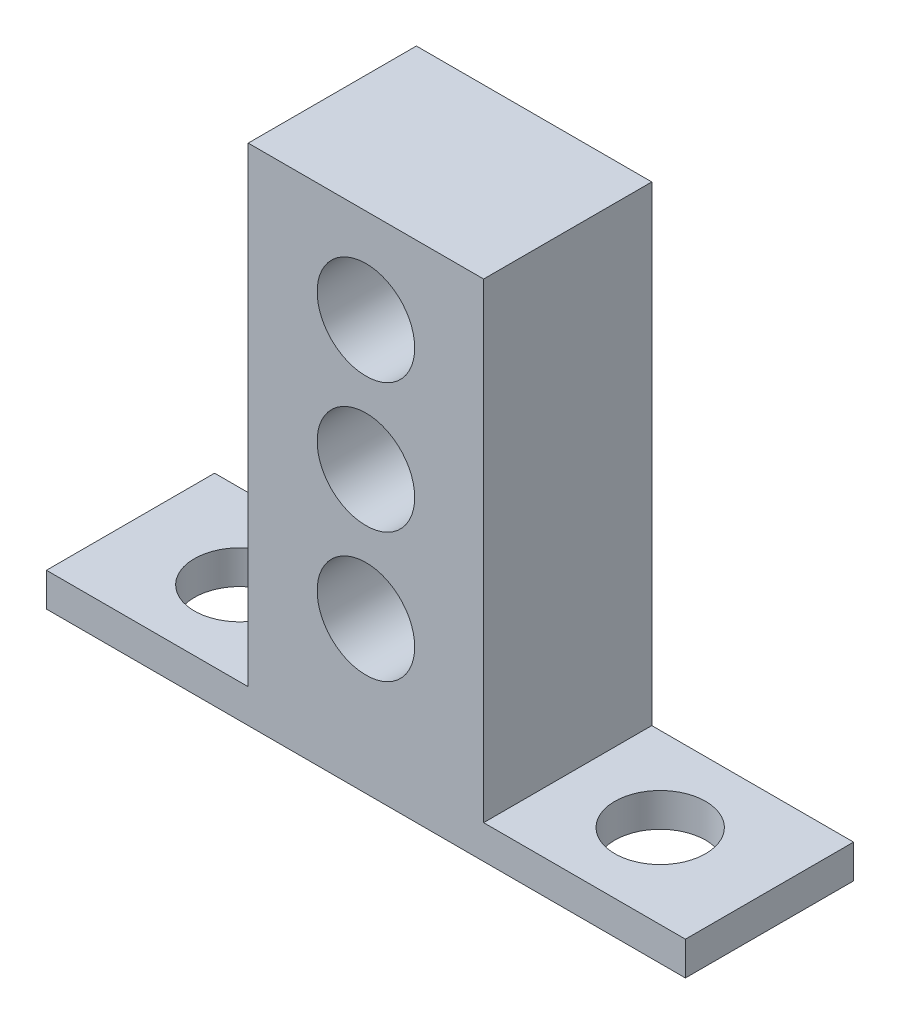
ISO-10303-21;
HEADER;
FILE_DESCRIPTION(('STEP AP214'),'2;1');
FILE_NAME('part.step','',(''),(''),'','','');
FILE_SCHEMA(('AUTOMOTIVE_DESIGN { 1 0 10303 214 1 1 1 1 }'));
ENDSEC;
DATA;
#1=APPLICATION_CONTEXT('core data for automotive mechanical design processes');
#2=APPLICATION_PROTOCOL_DEFINITION('international standard','automotive_design',2000,#1);
#3=PRODUCT_CONTEXT('',#1,'mechanical');
#4=PRODUCT('Part','Part','',(#3));
#5=PRODUCT_RELATED_PRODUCT_CATEGORY('part','',(#4));
#6=PRODUCT_DEFINITION_FORMATION('','',#4);
#7=PRODUCT_DEFINITION_CONTEXT('part definition',#1,'design');
#8=PRODUCT_DEFINITION('design','',#6,#7);
#9=PRODUCT_DEFINITION_SHAPE('','',#8);
#10=(LENGTH_UNIT() NAMED_UNIT(*) SI_UNIT(.MILLI.,.METRE.));
#11=(NAMED_UNIT(*) PLANE_ANGLE_UNIT() SI_UNIT($,.RADIAN.));
#12=(NAMED_UNIT(*) SI_UNIT($,.STERADIAN.) SOLID_ANGLE_UNIT());
#13=UNCERTAINTY_MEASURE_WITH_UNIT(LENGTH_MEASURE(1.E-05),#10,'distance_accuracy_value','');
#14=(GEOMETRIC_REPRESENTATION_CONTEXT(3) GLOBAL_UNCERTAINTY_ASSIGNED_CONTEXT((#13)) GLOBAL_UNIT_ASSIGNED_CONTEXT((#10,
#11,#12)) REPRESENTATION_CONTEXT('',''));
#15=CARTESIAN_POINT('',(0.,0.,0.));
#16=DIRECTION('',(0.,0.,1.));
#17=DIRECTION('',(1.,0.,0.));
#18=AXIS2_PLACEMENT_3D('',#15,#16,#17);
#19=CARTESIAN_POINT('',(0.,0.,12.7));
#20=DIRECTION('',(1.,0.,0.));
#21=DIRECTION('',(0.,0.,-1.));
#22=AXIS2_PLACEMENT_3D('',#19,#20,#21);
#23=PLANE('',#22);
#24=DIRECTION('',(0.,0.,-1.));
#25=VECTOR('',#24,1.);
#26=CARTESIAN_POINT('',(0.,2.54,12.7));
#27=LINE('',#26,#25);
#28=CARTESIAN_POINT('',(0.,2.54,12.7));
#29=VERTEX_POINT('',#28);
#30=CARTESIAN_POINT('',(0.,2.54,0.));
#31=VERTEX_POINT('',#30);
#32=EDGE_CURVE('E49',#29,#31,#27,.T.);
#33=ORIENTED_EDGE('',*,*,#32,.F.);
#34=DIRECTION('',(0.,-1.,0.));
#35=VECTOR('',#34,1.);
#36=CARTESIAN_POINT('',(0.,0.,12.7));
#37=LINE('',#36,#35);
#38=CARTESIAN_POINT('',(0.,38.1,12.7));
#39=VERTEX_POINT('',#38);
#40=EDGE_CURVE('E122',#39,#29,#37,.T.);
#41=ORIENTED_EDGE('',*,*,#40,.F.);
#42=DIRECTION('',(0.,0.,-1.));
#43=VECTOR('',#42,1.);
#44=CARTESIAN_POINT('',(0.,38.1,12.7));
#45=LINE('',#44,#43);
#46=CARTESIAN_POINT('',(0.,38.1,0.));
#47=VERTEX_POINT('',#46);
#48=EDGE_CURVE('E41',#39,#47,#45,.T.);
#49=ORIENTED_EDGE('',*,*,#48,.T.);
#50=DIRECTION('',(0.,-1.,0.));
#51=VECTOR('',#50,1.);
#52=CARTESIAN_POINT('',(0.,0.,0.));
#53=LINE('',#52,#51);
#54=EDGE_CURVE('E160',#47,#31,#53,.T.);
#55=ORIENTED_EDGE('',*,*,#54,.T.);
#56=EDGE_LOOP('',(#33,#41,#49,#55));
#57=FACE_BOUND('',#56,.T.);
#58=ADVANCED_FACE('F33',(#57),#23,.F.);
#59=CARTESIAN_POINT('',(17.78,0.,12.7));
#60=DIRECTION('',(-1.,0.,0.));
#61=DIRECTION('',(0.,0.,1.));
#62=AXIS2_PLACEMENT_3D('',#59,#60,#61);
#63=PLANE('',#62);
#64=DIRECTION('',(0.,0.,1.));
#65=VECTOR('',#64,1.);
#66=CARTESIAN_POINT('',(17.78,2.54,12.7));
#67=LINE('',#66,#65);
#68=CARTESIAN_POINT('',(17.78,2.54,0.));
#69=VERTEX_POINT('',#68);
#70=CARTESIAN_POINT('',(17.78,2.54,12.7));
#71=VERTEX_POINT('',#70);
#72=EDGE_CURVE('E57',#69,#71,#67,.T.);
#73=ORIENTED_EDGE('',*,*,#72,.F.);
#74=DIRECTION('',(0.,1.,0.));
#75=VECTOR('',#74,1.);
#76=CARTESIAN_POINT('',(17.78,0.,0.));
#77=LINE('',#76,#75);
#78=CARTESIAN_POINT('',(17.78,38.1,0.));
#79=VERTEX_POINT('',#78);
#80=EDGE_CURVE('E174',#69,#79,#77,.T.);
#81=ORIENTED_EDGE('',*,*,#80,.T.);
#82=DIRECTION('',(0.,0.,-1.));
#83=VECTOR('',#82,1.);
#84=CARTESIAN_POINT('',(17.78,38.1,12.7));
#85=LINE('',#84,#83);
#86=CARTESIAN_POINT('',(17.78,38.1,12.7));
#87=VERTEX_POINT('',#86);
#88=EDGE_CURVE('E11',#87,#79,#85,.T.);
#89=ORIENTED_EDGE('',*,*,#88,.F.);
#90=DIRECTION('',(0.,1.,0.));
#91=VECTOR('',#90,1.);
#92=CARTESIAN_POINT('',(17.78,0.,12.7));
#93=LINE('',#92,#91);
#94=EDGE_CURVE('E167',#71,#87,#93,.T.);
#95=ORIENTED_EDGE('',*,*,#94,.F.);
#96=EDGE_LOOP('',(#73,#81,#89,#95));
#97=FACE_BOUND('',#96,.T.);
#98=ADVANCED_FACE('F211',(#97),#63,.F.);
#99=CARTESIAN_POINT('',(0.,0.,12.7));
#100=DIRECTION('',(0.,0.,-1.));
#101=DIRECTION('',(-1.,0.,0.));
#102=AXIS2_PLACEMENT_3D('',#99,#100,#101);
#103=PLANE('',#102);
#104=ORIENTED_EDGE('',*,*,#40,.T.);
#105=DIRECTION('',(1.,0.,0.));
#106=VECTOR('',#105,1.);
#107=CARTESIAN_POINT('',(-15.24,2.54,12.7));
#108=LINE('',#107,#106);
#109=CARTESIAN_POINT('',(-15.24,2.54,12.7));
#110=VERTEX_POINT('',#109);
#111=EDGE_CURVE('E104',#110,#29,#108,.T.);
#112=ORIENTED_EDGE('',*,*,#111,.F.);
#113=DIRECTION('',(0.,1.,0.));
#114=VECTOR('',#113,1.);
#115=CARTESIAN_POINT('',(-15.24,0.,12.7));
#116=LINE('',#115,#114);
#117=CARTESIAN_POINT('',(-15.24,0.,12.7));
#118=VERTEX_POINT('',#117);
#119=EDGE_CURVE('E111',#118,#110,#116,.T.);
#120=ORIENTED_EDGE('',*,*,#119,.F.);
#121=DIRECTION('',(1.,0.,0.));
#122=VECTOR('',#121,1.);
#123=CARTESIAN_POINT('',(0.,0.,12.7));
#124=LINE('',#123,#122);
#125=CARTESIAN_POINT('',(33.02,0.,12.7));
#126=VERTEX_POINT('',#125);
#127=EDGE_CURVE('E164',#118,#126,#124,.T.);
#128=ORIENTED_EDGE('',*,*,#127,.T.);
#129=DIRECTION('',(0.,-1.,0.));
#130=VECTOR('',#129,1.);
#131=CARTESIAN_POINT('',(33.02,0.,12.7));
#132=LINE('',#131,#130);
#133=CARTESIAN_POINT('',(33.02,2.54,12.7));
#134=VERTEX_POINT('',#133);
#135=EDGE_CURVE('E124',#134,#126,#132,.T.);
#136=ORIENTED_EDGE('',*,*,#135,.F.);
#137=DIRECTION('',(-1.,0.,0.));
#138=VECTOR('',#137,1.);
#139=CARTESIAN_POINT('',(33.02,2.54,12.7));
#140=LINE('',#139,#138);
#141=EDGE_CURVE('E137',#134,#71,#140,.T.);
#142=ORIENTED_EDGE('',*,*,#141,.T.);
#143=ORIENTED_EDGE('',*,*,#94,.T.);
#144=DIRECTION('',(-1.,0.,0.));
#145=VECTOR('',#144,1.);
#146=CARTESIAN_POINT('',(0.,38.1,12.7));
#147=LINE('',#146,#145);
#148=EDGE_CURVE('E169',#87,#39,#147,.T.);
#149=ORIENTED_EDGE('',*,*,#148,.T.);
#150=EDGE_LOOP('',(#104,#112,#120,#128,#136,#142,#143,#149));
#151=FACE_BOUND('',#150,.T.);
#152=CARTESIAN_POINT('',(8.89,30.988,12.7));
#153=DIRECTION('',(0.,0.,1.));
#154=DIRECTION('',(1.,0.,0.));
#155=AXIS2_PLACEMENT_3D('',#152,#153,#154);
#156=CIRCLE('',#155,3.683);
#157=CARTESIAN_POINT('',(12.573,30.988,12.7));
#158=VERTEX_POINT('',#157);
#159=EDGE_CURVE('E157',#158,#158,#156,.T.);
#160=ORIENTED_EDGE('',*,*,#159,.F.);
#161=EDGE_LOOP('',(#160));
#162=FACE_BOUND('',#161,.T.);
#163=CARTESIAN_POINT('',(8.89,21.209,12.7));
#164=DIRECTION('',(0.,0.,1.));
#165=DIRECTION('',(1.,0.,0.));
#166=AXIS2_PLACEMENT_3D('',#163,#164,#165);
#167=CIRCLE('',#166,3.683);
#168=CARTESIAN_POINT('',(12.573,21.209,12.7));
#169=VERTEX_POINT('',#168);
#170=EDGE_CURVE('E151',#169,#169,#167,.T.);
#171=ORIENTED_EDGE('',*,*,#170,.F.);
#172=EDGE_LOOP('',(#171));
#173=FACE_BOUND('',#172,.T.);
#174=CARTESIAN_POINT('',(8.89,11.43,12.7));
#175=DIRECTION('',(0.,0.,1.));
#176=DIRECTION('',(1.,0.,0.));
#177=AXIS2_PLACEMENT_3D('',#174,#175,#176);
#178=CIRCLE('',#177,3.683);
#179=CARTESIAN_POINT('',(12.573,11.43,12.7));
#180=VERTEX_POINT('',#179);
#181=EDGE_CURVE('E145',#180,#180,#178,.T.);
#182=ORIENTED_EDGE('',*,*,#181,.F.);
#183=EDGE_LOOP('',(#182));
#184=FACE_BOUND('',#183,.T.);
#185=ADVANCED_FACE('F120',(#151,#162,#173,#184),#103,.F.);
#186=CARTESIAN_POINT('',(0.,0.,0.));
#187=DIRECTION('',(0.,0.,-1.));
#188=DIRECTION('',(-1.,0.,0.));
#189=AXIS2_PLACEMENT_3D('',#186,#187,#188);
#190=PLANE('',#189);
#191=CARTESIAN_POINT('',(8.89,21.209,0.));
#192=DIRECTION('',(0.,0.,1.));
#193=DIRECTION('',(1.,0.,0.));
#194=AXIS2_PLACEMENT_3D('',#191,#192,#193);
#195=CIRCLE('',#194,3.683);
#196=CARTESIAN_POINT('',(12.573,21.209,0.));
#197=VERTEX_POINT('',#196);
#198=EDGE_CURVE('E148',#197,#197,#195,.T.);
#199=ORIENTED_EDGE('',*,*,#198,.T.);
#200=EDGE_LOOP('',(#199));
#201=FACE_BOUND('',#200,.T.);
#202=ORIENTED_EDGE('',*,*,#54,.F.);
#203=DIRECTION('',(-1.,0.,0.));
#204=VECTOR('',#203,1.);
#205=CARTESIAN_POINT('',(0.,38.1,0.));
#206=LINE('',#205,#204);
#207=EDGE_CURVE('E165',#79,#47,#206,.T.);
#208=ORIENTED_EDGE('',*,*,#207,.F.);
#209=ORIENTED_EDGE('',*,*,#80,.F.);
#210=DIRECTION('',(-1.,0.,0.));
#211=VECTOR('',#210,1.);
#212=CARTESIAN_POINT('',(33.02,2.54,0.));
#213=LINE('',#212,#211);
#214=CARTESIAN_POINT('',(33.02,2.54,0.));
#215=VERTEX_POINT('',#214);
#216=EDGE_CURVE('E141',#215,#69,#213,.T.);
#217=ORIENTED_EDGE('',*,*,#216,.F.);
#218=DIRECTION('',(0.,1.,0.));
#219=VECTOR('',#218,1.);
#220=CARTESIAN_POINT('',(33.02,0.,0.));
#221=LINE('',#220,#219);
#222=CARTESIAN_POINT('',(33.02,0.,0.));
#223=VERTEX_POINT('',#222);
#224=EDGE_CURVE('E134',#223,#215,#221,.T.);
#225=ORIENTED_EDGE('',*,*,#224,.F.);
#226=DIRECTION('',(1.,0.,0.));
#227=VECTOR('',#226,1.);
#228=CARTESIAN_POINT('',(0.,0.,0.));
#229=LINE('',#228,#227);
#230=CARTESIAN_POINT('',(-15.24,0.,0.));
#231=VERTEX_POINT('',#230);
#232=EDGE_CURVE('E172',#231,#223,#229,.T.);
#233=ORIENTED_EDGE('',*,*,#232,.F.);
#234=DIRECTION('',(0.,-1.,0.));
#235=VECTOR('',#234,1.);
#236=CARTESIAN_POINT('',(-15.24,0.,0.));
#237=LINE('',#236,#235);
#238=CARTESIAN_POINT('',(-15.24,2.54,0.));
#239=VERTEX_POINT('',#238);
#240=EDGE_CURVE('E110',#239,#231,#237,.T.);
#241=ORIENTED_EDGE('',*,*,#240,.F.);
#242=DIRECTION('',(1.,0.,0.));
#243=VECTOR('',#242,1.);
#244=CARTESIAN_POINT('',(-15.24,2.54,0.));
#245=LINE('',#244,#243);
#246=EDGE_CURVE('E106',#239,#31,#245,.T.);
#247=ORIENTED_EDGE('',*,*,#246,.T.);
#248=EDGE_LOOP('',(#202,#208,#209,#217,#225,#233,#241,#247));
#249=FACE_BOUND('',#248,.T.);
#250=CARTESIAN_POINT('',(8.89,30.988,0.));
#251=DIRECTION('',(0.,0.,1.));
#252=DIRECTION('',(1.,0.,0.));
#253=AXIS2_PLACEMENT_3D('',#250,#251,#252);
#254=CIRCLE('',#253,3.683);
#255=CARTESIAN_POINT('',(12.573,30.988,0.));
#256=VERTEX_POINT('',#255);
#257=EDGE_CURVE('E154',#256,#256,#254,.T.);
#258=ORIENTED_EDGE('',*,*,#257,.T.);
#259=EDGE_LOOP('',(#258));
#260=FACE_BOUND('',#259,.T.);
#261=CARTESIAN_POINT('',(8.89,11.43,0.));
#262=DIRECTION('',(0.,0.,1.));
#263=DIRECTION('',(1.,0.,0.));
#264=AXIS2_PLACEMENT_3D('',#261,#262,#263);
#265=CIRCLE('',#264,3.683);
#266=CARTESIAN_POINT('',(12.573,11.43,0.));
#267=VERTEX_POINT('',#266);
#268=EDGE_CURVE('E144',#267,#267,#265,.T.);
#269=ORIENTED_EDGE('',*,*,#268,.T.);
#270=EDGE_LOOP('',(#269));
#271=FACE_BOUND('',#270,.T.);
#272=ADVANCED_FACE('F195',(#201,#249,#260,#271),#190,.T.);
#273=CARTESIAN_POINT('',(0.,0.,12.7));
#274=DIRECTION('',(0.,1.,0.));
#275=DIRECTION('',(0.,0.,1.));
#276=AXIS2_PLACEMENT_3D('',#273,#274,#275);
#277=PLANE('',#276);
#278=CARTESIAN_POINT('',(-6.985,0.,6.35000000000001));
#279=DIRECTION('',(0.,-1.,0.));
#280=DIRECTION('',(0.,0.,-1.));
#281=AXIS2_PLACEMENT_3D('',#278,#279,#280);
#282=CIRCLE('',#281,3.429);
#283=CARTESIAN_POINT('',(-6.985,0.,2.92100000000001));
#284=VERTEX_POINT('',#283);
#285=EDGE_CURVE('E180',#284,#284,#282,.T.);
#286=ORIENTED_EDGE('',*,*,#285,.F.);
#287=EDGE_LOOP('',(#286));
#288=FACE_BOUND('',#287,.T.);
#289=CARTESIAN_POINT('',(24.765,0.,6.35));
#290=DIRECTION('',(0.,-1.,0.));
#291=DIRECTION('',(0.,0.,-1.));
#292=AXIS2_PLACEMENT_3D('',#289,#290,#291);
#293=CIRCLE('',#292,3.429);
#294=CARTESIAN_POINT('',(24.765,0.,2.921));
#295=VERTEX_POINT('',#294);
#296=EDGE_CURVE('E185',#295,#295,#293,.T.);
#297=ORIENTED_EDGE('',*,*,#296,.F.);
#298=EDGE_LOOP('',(#297));
#299=FACE_BOUND('',#298,.T.);
#300=ORIENTED_EDGE('',*,*,#232,.T.);
#301=DIRECTION('',(0.,0.,-1.));
#302=VECTOR('',#301,1.);
#303=CARTESIAN_POINT('',(33.02,0.,12.7));
#304=LINE('',#303,#302);
#305=EDGE_CURVE('E131',#126,#223,#304,.T.);
#306=ORIENTED_EDGE('',*,*,#305,.F.);
#307=ORIENTED_EDGE('',*,*,#127,.F.);
#308=DIRECTION('',(0.,0.,1.));
#309=VECTOR('',#308,1.);
#310=CARTESIAN_POINT('',(-15.24,0.,12.7));
#311=LINE('',#310,#309);
#312=EDGE_CURVE('E117',#231,#118,#311,.T.);
#313=ORIENTED_EDGE('',*,*,#312,.F.);
#314=EDGE_LOOP('',(#300,#306,#307,#313));
#315=FACE_BOUND('',#314,.T.);
#316=ADVANCED_FACE('F200',(#288,#299,#315),#277,.F.);
#317=CARTESIAN_POINT('',(0.,38.1,12.7));
#318=DIRECTION('',(0.,-1.,0.));
#319=DIRECTION('',(0.,0.,-1.));
#320=AXIS2_PLACEMENT_3D('',#317,#318,#319);
#321=PLANE('',#320);
#322=ORIENTED_EDGE('',*,*,#207,.T.);
#323=ORIENTED_EDGE('',*,*,#48,.F.);
#324=ORIENTED_EDGE('',*,*,#148,.F.);
#325=ORIENTED_EDGE('',*,*,#88,.T.);
#326=EDGE_LOOP('',(#322,#323,#324,#325));
#327=FACE_BOUND('',#326,.T.);
#328=ADVANCED_FACE('F214',(#327),#321,.F.);
#329=CARTESIAN_POINT('',(8.89,30.988,12.7));
#330=DIRECTION('',(0.,0.,-1.));
#331=DIRECTION('',(-1.,0.,0.));
#332=AXIS2_PLACEMENT_3D('',#329,#330,#331);
#333=CYLINDRICAL_SURFACE('',#332,3.683);
#334=ORIENTED_EDGE('',*,*,#159,.T.);
#335=EDGE_LOOP('',(#334));
#336=FACE_BOUND('',#335,.T.);
#337=ORIENTED_EDGE('',*,*,#257,.F.);
#338=EDGE_LOOP('',(#337));
#339=FACE_BOUND('',#338,.T.);
#340=ADVANCED_FACE('F233',(#336,#339),#333,.F.);
#341=CARTESIAN_POINT('',(8.89,21.209,12.7));
#342=DIRECTION('',(0.,0.,-1.));
#343=DIRECTION('',(-1.,0.,0.));
#344=AXIS2_PLACEMENT_3D('',#341,#342,#343);
#345=CYLINDRICAL_SURFACE('',#344,3.683);
#346=ORIENTED_EDGE('',*,*,#170,.T.);
#347=EDGE_LOOP('',(#346));
#348=FACE_BOUND('',#347,.T.);
#349=ORIENTED_EDGE('',*,*,#198,.F.);
#350=EDGE_LOOP('',(#349));
#351=FACE_BOUND('',#350,.T.);
#352=ADVANCED_FACE('F253',(#348,#351),#345,.F.);
#353=CARTESIAN_POINT('',(8.89,11.43,12.7));
#354=DIRECTION('',(0.,0.,-1.));
#355=DIRECTION('',(-1.,0.,0.));
#356=AXIS2_PLACEMENT_3D('',#353,#354,#355);
#357=CYLINDRICAL_SURFACE('',#356,3.683);
#358=ORIENTED_EDGE('',*,*,#181,.T.);
#359=EDGE_LOOP('',(#358));
#360=FACE_BOUND('',#359,.T.);
#361=ORIENTED_EDGE('',*,*,#268,.F.);
#362=EDGE_LOOP('',(#361));
#363=FACE_BOUND('',#362,.T.);
#364=ADVANCED_FACE('F246',(#360,#363),#357,.F.);
#365=CARTESIAN_POINT('',(33.02,2.54,12.7));
#366=DIRECTION('',(0.,-1.,0.));
#367=DIRECTION('',(0.,0.,-1.));
#368=AXIS2_PLACEMENT_3D('',#365,#366,#367);
#369=PLANE('',#368);
#370=CARTESIAN_POINT('',(24.765,2.54000000000001,6.35));
#371=DIRECTION('',(0.,-1.,0.));
#372=DIRECTION('',(0.,0.,-1.));
#373=AXIS2_PLACEMENT_3D('',#370,#371,#372);
#374=CIRCLE('',#373,3.429);
#375=CARTESIAN_POINT('',(24.765,2.54000000000001,2.921));
#376=VERTEX_POINT('',#375);
#377=EDGE_CURVE('E36',#376,#376,#374,.T.);
#378=ORIENTED_EDGE('',*,*,#377,.T.);
#379=EDGE_LOOP('',(#378));
#380=FACE_BOUND('',#379,.T.);
#381=ORIENTED_EDGE('',*,*,#72,.T.);
#382=ORIENTED_EDGE('',*,*,#141,.F.);
#383=DIRECTION('',(0.,0.,1.));
#384=VECTOR('',#383,1.);
#385=CARTESIAN_POINT('',(33.02,2.54,12.7));
#386=LINE('',#385,#384);
#387=EDGE_CURVE('E136',#215,#134,#386,.T.);
#388=ORIENTED_EDGE('',*,*,#387,.F.);
#389=ORIENTED_EDGE('',*,*,#216,.T.);
#390=EDGE_LOOP('',(#381,#382,#388,#389));
#391=FACE_BOUND('',#390,.T.);
#392=ADVANCED_FACE('F209',(#380,#391),#369,.F.);
#393=CARTESIAN_POINT('',(33.02,0.,0.));
#394=DIRECTION('',(-1.,0.,0.));
#395=DIRECTION('',(0.,0.,1.));
#396=AXIS2_PLACEMENT_3D('',#393,#394,#395);
#397=PLANE('',#396);
#398=ORIENTED_EDGE('',*,*,#135,.T.);
#399=ORIENTED_EDGE('',*,*,#305,.T.);
#400=ORIENTED_EDGE('',*,*,#224,.T.);
#401=ORIENTED_EDGE('',*,*,#387,.T.);
#402=EDGE_LOOP('',(#398,#399,#400,#401));
#403=FACE_BOUND('',#402,.T.);
#404=ADVANCED_FACE('F205',(#403),#397,.F.);
#405=CARTESIAN_POINT('',(-15.24,2.54,12.7));
#406=DIRECTION('',(0.,-1.,0.));
#407=DIRECTION('',(0.,0.,-1.));
#408=AXIS2_PLACEMENT_3D('',#405,#406,#407);
#409=PLANE('',#408);
#410=CARTESIAN_POINT('',(-6.985,2.54000000000001,6.35000000000001));
#411=DIRECTION('',(0.,-1.,0.));
#412=DIRECTION('',(0.,0.,-1.));
#413=AXIS2_PLACEMENT_3D('',#410,#411,#412);
#414=CIRCLE('',#413,3.429);
#415=CARTESIAN_POINT('',(-6.985,2.54000000000001,2.92100000000001));
#416=VERTEX_POINT('',#415);
#417=EDGE_CURVE('E178',#416,#416,#414,.T.);
#418=ORIENTED_EDGE('',*,*,#417,.T.);
#419=EDGE_LOOP('',(#418));
#420=FACE_BOUND('',#419,.T.);
#421=ORIENTED_EDGE('',*,*,#32,.T.);
#422=ORIENTED_EDGE('',*,*,#246,.F.);
#423=DIRECTION('',(0.,0.,-1.));
#424=VECTOR('',#423,1.);
#425=CARTESIAN_POINT('',(-15.24,2.54,12.7));
#426=LINE('',#425,#424);
#427=EDGE_CURVE('E100',#110,#239,#426,.T.);
#428=ORIENTED_EDGE('',*,*,#427,.F.);
#429=ORIENTED_EDGE('',*,*,#111,.T.);
#430=EDGE_LOOP('',(#421,#422,#428,#429));
#431=FACE_BOUND('',#430,.T.);
#432=ADVANCED_FACE('F102',(#420,#431),#409,.F.);
#433=CARTESIAN_POINT('',(-15.24,0.,0.));
#434=DIRECTION('',(-1.,0.,0.));
#435=DIRECTION('',(0.,0.,1.));
#436=AXIS2_PLACEMENT_3D('',#433,#434,#435);
#437=PLANE('',#436);
#438=ORIENTED_EDGE('',*,*,#119,.T.);
#439=ORIENTED_EDGE('',*,*,#427,.T.);
#440=ORIENTED_EDGE('',*,*,#240,.T.);
#441=ORIENTED_EDGE('',*,*,#312,.T.);
#442=EDGE_LOOP('',(#438,#439,#440,#441));
#443=FACE_BOUND('',#442,.T.);
#444=ADVANCED_FACE('F115',(#443),#437,.T.);
#445=CARTESIAN_POINT('',(-6.985,38.1,6.35000000000001));
#446=DIRECTION('',(0.,-1.,0.));
#447=DIRECTION('',(0.,0.,-1.));
#448=AXIS2_PLACEMENT_3D('',#445,#446,#447);
#449=CYLINDRICAL_SURFACE('',#448,3.429);
#450=CARTESIAN_POINT('',(-6.985,0.,2.92100000000001));
#451=CARTESIAN_POINT('',(-6.985,0.0264583333333332,2.92100000000001));
#452=CARTESIAN_POINT('',(-6.985,0.0529166666666664,2.92100000000001));
#453=CARTESIAN_POINT('',(-6.985,0.105833333333333,2.92100000000001));
#454=CARTESIAN_POINT('',(-6.985,0.132291666666666,2.92100000000001));
#455=CARTESIAN_POINT('',(-6.985,0.185208333333332,2.92100000000001));
#456=CARTESIAN_POINT('',(-6.985,0.211666666666666,2.92100000000001));
#457=CARTESIAN_POINT('',(-6.985,0.264583333333332,2.92100000000001));
#458=CARTESIAN_POINT('',(-6.985,0.291041666666665,2.92100000000001));
#459=CARTESIAN_POINT('',(-6.985,0.343958333333334,2.92100000000001));
#460=CARTESIAN_POINT('',(-6.985,0.370416666666669,2.92100000000001));
#461=CARTESIAN_POINT('',(-6.985,0.423333333333338,2.92100000000001));
#462=CARTESIAN_POINT('',(-6.985,0.449791666666671,2.92100000000001));
#463=CARTESIAN_POINT('',(-6.985,0.502708333333338,2.92100000000001));
#464=CARTESIAN_POINT('',(-6.985,0.529166666666671,2.92100000000001));
#465=CARTESIAN_POINT('',(-6.985,0.582083333333337,2.92100000000001));
#466=CARTESIAN_POINT('',(-6.985,0.60854166666667,2.92100000000001));
#467=CARTESIAN_POINT('',(-6.985,0.661458333333337,2.92100000000001));
#468=CARTESIAN_POINT('',(-6.985,0.68791666666667,2.92100000000001));
#469=CARTESIAN_POINT('',(-6.985,0.740833333333336,2.92100000000001));
#470=CARTESIAN_POINT('',(-6.985,0.76729166666667,2.92100000000001));
#471=CARTESIAN_POINT('',(-6.985,0.820208333333336,2.92100000000001));
#472=CARTESIAN_POINT('',(-6.985,0.846666666666669,2.92100000000001));
#473=CARTESIAN_POINT('',(-6.985,0.899583333333338,2.92100000000001));
#474=CARTESIAN_POINT('',(-6.985,0.926041666666673,2.92100000000001));
#475=CARTESIAN_POINT('',(-6.985,0.978958333333342,2.92100000000001));
#476=CARTESIAN_POINT('',(-6.985,1.00541666666668,2.92100000000001));
#477=CARTESIAN_POINT('',(-6.985,1.05833333333334,2.92100000000001));
#478=CARTESIAN_POINT('',(-6.985,1.08479166666667,2.92100000000001));
#479=CARTESIAN_POINT('',(-6.985,1.13770833333334,2.92100000000001));
#480=CARTESIAN_POINT('',(-6.985,1.16416666666667,2.92100000000001));
#481=CARTESIAN_POINT('',(-6.985,1.21708333333334,2.92100000000001));
#482=CARTESIAN_POINT('',(-6.985,1.24354166666667,2.92100000000001));
#483=CARTESIAN_POINT('',(-6.985,1.29645833333334,2.92100000000001));
#484=CARTESIAN_POINT('',(-6.985,1.32291666666667,2.92100000000001));
#485=CARTESIAN_POINT('',(-6.985,1.37583333333334,2.92100000000001));
#486=CARTESIAN_POINT('',(-6.985,1.40229166666667,2.92100000000001));
#487=CARTESIAN_POINT('',(-6.985,1.45520833333334,2.92100000000001));
#488=CARTESIAN_POINT('',(-6.985,1.48166666666667,2.92100000000001));
#489=CARTESIAN_POINT('',(-6.985,1.53458333333334,2.92100000000001));
#490=CARTESIAN_POINT('',(-6.985,1.56104166666667,2.92100000000001));
#491=CARTESIAN_POINT('',(-6.985,1.61395833333334,2.92100000000001));
#492=CARTESIAN_POINT('',(-6.985,1.64041666666668,2.92100000000001));
#493=CARTESIAN_POINT('',(-6.985,1.69333333333335,2.92100000000001));
#494=CARTESIAN_POINT('',(-6.985,1.71979166666668,2.92100000000001));
#495=CARTESIAN_POINT('',(-6.985,1.77270833333334,2.92100000000001));
#496=CARTESIAN_POINT('',(-6.985,1.79916666666668,2.92100000000001));
#497=CARTESIAN_POINT('',(-6.985,1.85208333333334,2.92100000000001));
#498=CARTESIAN_POINT('',(-6.985,1.87854166666668,2.92100000000001));
#499=CARTESIAN_POINT('',(-6.985,1.93145833333334,2.92100000000001));
#500=CARTESIAN_POINT('',(-6.985,1.95791666666668,2.92100000000001));
#501=CARTESIAN_POINT('',(-6.985,2.01083333333334,2.92100000000001));
#502=CARTESIAN_POINT('',(-6.985,2.03729166666668,2.92100000000001));
#503=CARTESIAN_POINT('',(-6.985,2.09020833333334,2.92100000000001));
#504=CARTESIAN_POINT('',(-6.985,2.11666666666668,2.92100000000001));
#505=CARTESIAN_POINT('',(-6.985,2.16958333333335,2.92100000000001));
#506=CARTESIAN_POINT('',(-6.985,2.19604166666668,2.92100000000001));
#507=CARTESIAN_POINT('',(-6.985,2.24895833333335,2.92100000000001));
#508=CARTESIAN_POINT('',(-6.985,2.27541666666668,2.92100000000001));
#509=CARTESIAN_POINT('',(-6.985,2.32833333333335,2.92100000000001));
#510=CARTESIAN_POINT('',(-6.985,2.35479166666668,2.92100000000001));
#511=CARTESIAN_POINT('',(-6.985,2.40770833333335,2.92100000000001));
#512=CARTESIAN_POINT('',(-6.985,2.43416666666668,2.92100000000001));
#513=CARTESIAN_POINT('',(-6.985,2.48708333333335,2.92100000000001));
#514=CARTESIAN_POINT('',(-6.985,2.51354166666668,2.92100000000001));
#515=CARTESIAN_POINT('',(-6.985,2.54000000000001,2.92100000000001));
#516=B_SPLINE_CURVE_WITH_KNOTS('',3,(#450,#451,#452,#453,#454,#455,#456,#457,#458,#459,#460,
#461,#462,#463,#464,#465,#466,#467,#468,#469,#470,#471,#472,#473,#474,#475,#476,#477,#478,#479,
#480,#481,#482,#483,#484,#485,#486,#487,#488,#489,#490,#491,#492,#493,#494,#495,#496,#497,#498,
#499,#500,#501,#502,#503,#504,#505,#506,#507,#508,#509,#510,#511,#512,#513,#514,#515),
.UNSPECIFIED.,.F.,.F.,(4,2,2,2,2,2,2,2,2,2,2,2,2,2,2,2,2,2,2,2,2,2,2,2,2,2,2,2,2,2,2,2,4),(0.,
0.0793749999999996,0.158749999999999,0.238124999999999,0.317499999999998,0.396875000000005,
0.476250000000004,0.555625000000004,0.635000000000004,0.714375000000003,0.793750000000003,
0.873125000000002,0.952500000000009,1.03187500000001,1.11125000000001,1.19062500000001,
1.27000000000001,1.34937500000001,1.42875000000001,1.50812500000001,1.58750000000001,
1.66687500000001,1.74625000000001,1.82562500000001,1.90500000000001,1.98437500000001,
2.06375000000001,2.14312500000001,2.22250000000002,2.30187500000002,2.38125000000002,
2.46062500000001,2.54000000000001),.UNSPECIFIED.);
#517=EDGE_CURVE('BSEAM241',#284,#416,#516,.T.);
#518=ORIENTED_EDGE('',*,*,#285,.T.);
#519=ORIENTED_EDGE('',*,*,#417,.F.);
#520=ORIENTED_EDGE('',*,*,#517,.T.);
#521=ORIENTED_EDGE('',*,*,#517,.F.);
#522=EDGE_LOOP('',(#518,#520,#519,#521));
#523=FACE_BOUND('',#522,.T.);
#524=ADVANCED_FACE('F241',(#523),#449,.F.);
#525=CARTESIAN_POINT('',(24.765,38.1,6.35));
#526=DIRECTION('',(0.,-1.,0.));
#527=DIRECTION('',(0.,0.,-1.));
#528=AXIS2_PLACEMENT_3D('',#525,#526,#527);
#529=CYLINDRICAL_SURFACE('',#528,3.429);
#530=CARTESIAN_POINT('',(24.765,0.,2.921));
#531=CARTESIAN_POINT('',(24.765,0.0264583333333332,2.921));
#532=CARTESIAN_POINT('',(24.765,0.0529166666666664,2.921));
#533=CARTESIAN_POINT('',(24.765,0.105833333333333,2.921));
#534=CARTESIAN_POINT('',(24.765,0.132291666666666,2.921));
#535=CARTESIAN_POINT('',(24.765,0.185208333333332,2.921));
#536=CARTESIAN_POINT('',(24.765,0.211666666666666,2.921));
#537=CARTESIAN_POINT('',(24.765,0.264583333333332,2.921));
#538=CARTESIAN_POINT('',(24.765,0.291041666666665,2.921));
#539=CARTESIAN_POINT('',(24.765,0.343958333333334,2.921));
#540=CARTESIAN_POINT('',(24.765,0.370416666666669,2.921));
#541=CARTESIAN_POINT('',(24.765,0.423333333333338,2.921));
#542=CARTESIAN_POINT('',(24.765,0.449791666666671,2.921));
#543=CARTESIAN_POINT('',(24.765,0.502708333333338,2.921));
#544=CARTESIAN_POINT('',(24.765,0.529166666666671,2.921));
#545=CARTESIAN_POINT('',(24.765,0.582083333333337,2.921));
#546=CARTESIAN_POINT('',(24.765,0.60854166666667,2.921));
#547=CARTESIAN_POINT('',(24.765,0.661458333333337,2.921));
#548=CARTESIAN_POINT('',(24.765,0.68791666666667,2.921));
#549=CARTESIAN_POINT('',(24.765,0.740833333333336,2.921));
#550=CARTESIAN_POINT('',(24.765,0.76729166666667,2.921));
#551=CARTESIAN_POINT('',(24.765,0.820208333333336,2.921));
#552=CARTESIAN_POINT('',(24.765,0.846666666666669,2.921));
#553=CARTESIAN_POINT('',(24.765,0.899583333333338,2.921));
#554=CARTESIAN_POINT('',(24.765,0.926041666666673,2.921));
#555=CARTESIAN_POINT('',(24.765,0.978958333333342,2.921));
#556=CARTESIAN_POINT('',(24.765,1.00541666666668,2.921));
#557=CARTESIAN_POINT('',(24.765,1.05833333333334,2.921));
#558=CARTESIAN_POINT('',(24.765,1.08479166666667,2.921));
#559=CARTESIAN_POINT('',(24.765,1.13770833333334,2.921));
#560=CARTESIAN_POINT('',(24.765,1.16416666666667,2.921));
#561=CARTESIAN_POINT('',(24.765,1.21708333333334,2.921));
#562=CARTESIAN_POINT('',(24.765,1.24354166666667,2.921));
#563=CARTESIAN_POINT('',(24.765,1.29645833333334,2.921));
#564=CARTESIAN_POINT('',(24.765,1.32291666666667,2.921));
#565=CARTESIAN_POINT('',(24.765,1.37583333333334,2.921));
#566=CARTESIAN_POINT('',(24.765,1.40229166666667,2.921));
#567=CARTESIAN_POINT('',(24.765,1.45520833333334,2.921));
#568=CARTESIAN_POINT('',(24.765,1.48166666666667,2.921));
#569=CARTESIAN_POINT('',(24.765,1.53458333333334,2.921));
#570=CARTESIAN_POINT('',(24.765,1.56104166666667,2.921));
#571=CARTESIAN_POINT('',(24.765,1.61395833333334,2.921));
#572=CARTESIAN_POINT('',(24.765,1.64041666666668,2.921));
#573=CARTESIAN_POINT('',(24.765,1.69333333333335,2.921));
#574=CARTESIAN_POINT('',(24.765,1.71979166666668,2.921));
#575=CARTESIAN_POINT('',(24.765,1.77270833333334,2.921));
#576=CARTESIAN_POINT('',(24.765,1.79916666666668,2.921));
#577=CARTESIAN_POINT('',(24.765,1.85208333333334,2.921));
#578=CARTESIAN_POINT('',(24.765,1.87854166666668,2.921));
#579=CARTESIAN_POINT('',(24.765,1.93145833333334,2.921));
#580=CARTESIAN_POINT('',(24.765,1.95791666666668,2.921));
#581=CARTESIAN_POINT('',(24.765,2.01083333333334,2.921));
#582=CARTESIAN_POINT('',(24.765,2.03729166666668,2.921));
#583=CARTESIAN_POINT('',(24.765,2.09020833333334,2.921));
#584=CARTESIAN_POINT('',(24.765,2.11666666666668,2.921));
#585=CARTESIAN_POINT('',(24.765,2.16958333333335,2.921));
#586=CARTESIAN_POINT('',(24.765,2.19604166666668,2.921));
#587=CARTESIAN_POINT('',(24.765,2.24895833333335,2.921));
#588=CARTESIAN_POINT('',(24.765,2.27541666666668,2.921));
#589=CARTESIAN_POINT('',(24.765,2.32833333333335,2.921));
#590=CARTESIAN_POINT('',(24.765,2.35479166666668,2.921));
#591=CARTESIAN_POINT('',(24.765,2.40770833333335,2.921));
#592=CARTESIAN_POINT('',(24.765,2.43416666666668,2.921));
#593=CARTESIAN_POINT('',(24.765,2.48708333333335,2.921));
#594=CARTESIAN_POINT('',(24.765,2.51354166666668,2.921));
#595=CARTESIAN_POINT('',(24.765,2.54000000000001,2.921));
#596=B_SPLINE_CURVE_WITH_KNOTS('',3,(#530,#531,#532,#533,#534,#535,#536,#537,#538,#539,#540,
#541,#542,#543,#544,#545,#546,#547,#548,#549,#550,#551,#552,#553,#554,#555,#556,#557,#558,#559,
#560,#561,#562,#563,#564,#565,#566,#567,#568,#569,#570,#571,#572,#573,#574,#575,#576,#577,#578,
#579,#580,#581,#582,#583,#584,#585,#586,#587,#588,#589,#590,#591,#592,#593,#594,#595),
.UNSPECIFIED.,.F.,.F.,(4,2,2,2,2,2,2,2,2,2,2,2,2,2,2,2,2,2,2,2,2,2,2,2,2,2,2,2,2,2,2,2,4),(0.,
0.0793749999999996,0.158749999999999,0.238124999999999,0.317499999999998,0.396875000000005,
0.476250000000004,0.555625000000004,0.635000000000004,0.714375000000003,0.793750000000003,
0.873125000000002,0.952500000000009,1.03187500000001,1.11125000000001,1.19062500000001,
1.27000000000001,1.34937500000001,1.42875000000001,1.50812500000001,1.58750000000001,
1.66687500000001,1.74625000000001,1.82562500000001,1.90500000000001,1.98437500000001,
2.06375000000001,2.14312500000001,2.22250000000002,2.30187500000002,2.38125000000002,
2.46062500000001,2.54000000000001),.UNSPECIFIED.);
#597=EDGE_CURVE('BSEAM238',#295,#376,#596,.T.);
#598=ORIENTED_EDGE('',*,*,#296,.T.);
#599=ORIENTED_EDGE('',*,*,#377,.F.);
#600=ORIENTED_EDGE('',*,*,#597,.T.);
#601=ORIENTED_EDGE('',*,*,#597,.F.);
#602=EDGE_LOOP('',(#598,#600,#599,#601));
#603=FACE_BOUND('',#602,.T.);
#604=ADVANCED_FACE('F238',(#603),#529,.F.);
#605=CLOSED_SHELL('',(#58,#98,#185,#272,#316,#328,#340,#352,#364,#392,#404,#432,#444,#524,#604));
#606=MANIFOLD_SOLID_BREP('B2',#605);
#607=ADVANCED_BREP_SHAPE_REPRESENTATION('',(#18,#606),#14);
#608=SHAPE_DEFINITION_REPRESENTATION(#9,#607);
ENDSEC;
END-ISO-10303-21;
